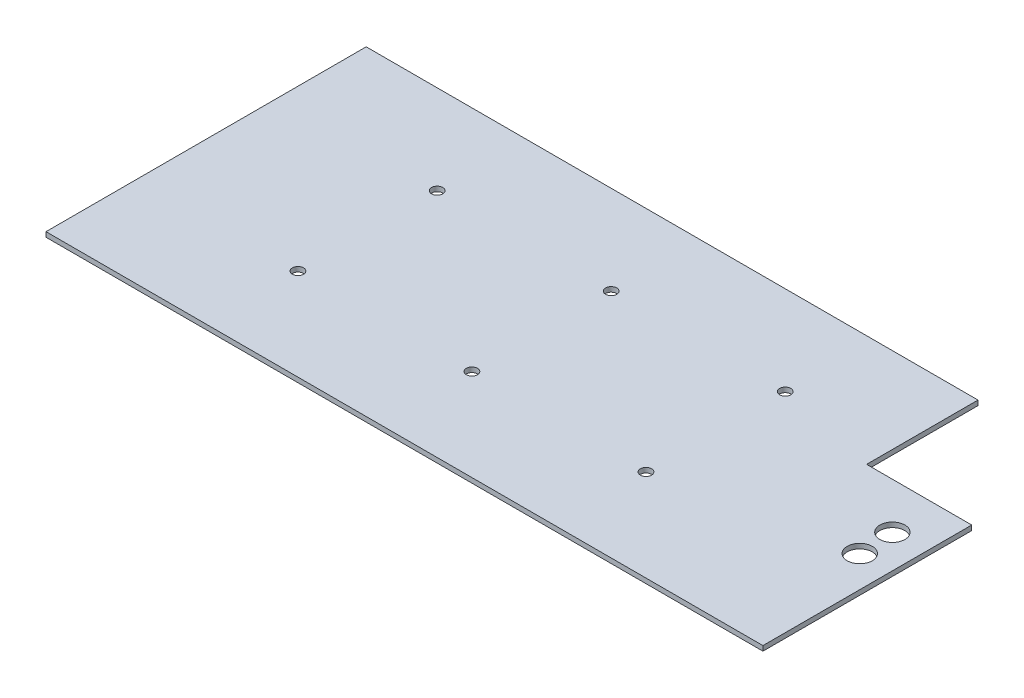
ISO-10303-21;
HEADER;
FILE_DESCRIPTION(('STEP AP214'),'2;1');
FILE_NAME('part.step','',(''),(''),'','','');
FILE_SCHEMA(('AUTOMOTIVE_DESIGN { 1 0 10303 214 1 1 1 1 }'));
ENDSEC;
DATA;
#1=APPLICATION_CONTEXT('core data for automotive mechanical design processes');
#2=APPLICATION_PROTOCOL_DEFINITION('international standard','automotive_design',2000,#1);
#3=PRODUCT_CONTEXT('',#1,'mechanical');
#4=PRODUCT('Part','Part','',(#3));
#5=PRODUCT_RELATED_PRODUCT_CATEGORY('part','',(#4));
#6=PRODUCT_DEFINITION_FORMATION('','',#4);
#7=PRODUCT_DEFINITION_CONTEXT('part definition',#1,'design');
#8=PRODUCT_DEFINITION('design','',#6,#7);
#9=PRODUCT_DEFINITION_SHAPE('','',#8);
#10=(LENGTH_UNIT() NAMED_UNIT(*) SI_UNIT(.MILLI.,.METRE.));
#11=(NAMED_UNIT(*) PLANE_ANGLE_UNIT() SI_UNIT($,.RADIAN.));
#12=(NAMED_UNIT(*) SI_UNIT($,.STERADIAN.) SOLID_ANGLE_UNIT());
#13=UNCERTAINTY_MEASURE_WITH_UNIT(LENGTH_MEASURE(1.E-05),#10,'distance_accuracy_value','');
#14=(GEOMETRIC_REPRESENTATION_CONTEXT(3) GLOBAL_UNCERTAINTY_ASSIGNED_CONTEXT((#13)) GLOBAL_UNIT_ASSIGNED_CONTEXT((#10,
#11,#12)) REPRESENTATION_CONTEXT('',''));
#15=CARTESIAN_POINT('',(0.,0.,0.));
#16=DIRECTION('',(0.,0.,1.));
#17=DIRECTION('',(1.,0.,0.));
#18=AXIS2_PLACEMENT_3D('',#15,#16,#17);
#19=CARTESIAN_POINT('',(515.,3.5,0.));
#20=DIRECTION('',(0.,0.,-1.));
#21=DIRECTION('',(-1.,0.,0.));
#22=AXIS2_PLACEMENT_3D('',#19,#20,#21);
#23=PLANE('',#22);
#24=DIRECTION('',(1.,0.,0.));
#25=VECTOR('',#24,1.);
#26=CARTESIAN_POINT('',(515.,0.,0.));
#27=LINE('',#26,#25);
#28=CARTESIAN_POINT('',(0.,0.,0.));
#29=VERTEX_POINT('',#28);
#30=CARTESIAN_POINT('',(515.,0.,0.));
#31=VERTEX_POINT('',#30);
#32=EDGE_CURVE('E135',#29,#31,#27,.T.);
#33=ORIENTED_EDGE('',*,*,#32,.T.);
#34=DIRECTION('',(0.,-1.,0.));
#35=VECTOR('',#34,1.);
#36=CARTESIAN_POINT('',(515.,3.5,0.));
#37=LINE('',#36,#35);
#38=CARTESIAN_POINT('',(515.,3.5,0.));
#39=VERTEX_POINT('',#38);
#40=EDGE_CURVE('E11',#39,#31,#37,.T.);
#41=ORIENTED_EDGE('',*,*,#40,.F.);
#42=DIRECTION('',(1.,0.,0.));
#43=VECTOR('',#42,1.);
#44=CARTESIAN_POINT('',(515.,3.5,0.));
#45=LINE('',#44,#43);
#46=CARTESIAN_POINT('',(0.,3.5,0.));
#47=VERTEX_POINT('',#46);
#48=EDGE_CURVE('E153',#47,#39,#45,.T.);
#49=ORIENTED_EDGE('',*,*,#48,.F.);
#50=DIRECTION('',(0.,-1.,0.));
#51=VECTOR('',#50,1.);
#52=CARTESIAN_POINT('',(0.,3.5,0.));
#53=LINE('',#52,#51);
#54=EDGE_CURVE('E131',#47,#29,#53,.T.);
#55=ORIENTED_EDGE('',*,*,#54,.T.);
#56=EDGE_LOOP('',(#33,#41,#49,#55));
#57=FACE_BOUND('',#56,.T.);
#58=ADVANCED_FACE('F45',(#57),#23,.F.);
#59=CARTESIAN_POINT('',(515.,3.5,-150.));
#60=DIRECTION('',(-1.,0.,0.));
#61=DIRECTION('',(0.,0.,1.));
#62=AXIS2_PLACEMENT_3D('',#59,#60,#61);
#63=PLANE('',#62);
#64=DIRECTION('',(0.,0.,-1.));
#65=VECTOR('',#64,1.);
#66=CARTESIAN_POINT('',(515.,0.,-150.));
#67=LINE('',#66,#65);
#68=CARTESIAN_POINT('',(515.,0.,-150.));
#69=VERTEX_POINT('',#68);
#70=EDGE_CURVE('E139',#31,#69,#67,.T.);
#71=ORIENTED_EDGE('',*,*,#70,.T.);
#72=DIRECTION('',(0.,-1.,0.));
#73=VECTOR('',#72,1.);
#74=CARTESIAN_POINT('',(515.,3.5,-150.));
#75=LINE('',#74,#73);
#76=CARTESIAN_POINT('',(515.,3.5,-150.));
#77=VERTEX_POINT('',#76);
#78=EDGE_CURVE('E54',#77,#69,#75,.T.);
#79=ORIENTED_EDGE('',*,*,#78,.F.);
#80=DIRECTION('',(0.,0.,-1.));
#81=VECTOR('',#80,1.);
#82=CARTESIAN_POINT('',(515.,3.5,-150.));
#83=LINE('',#82,#81);
#84=EDGE_CURVE('E96',#39,#77,#83,.T.);
#85=ORIENTED_EDGE('',*,*,#84,.F.);
#86=ORIENTED_EDGE('',*,*,#40,.T.);
#87=EDGE_LOOP('',(#71,#79,#85,#86));
#88=FACE_BOUND('',#87,.T.);
#89=ADVANCED_FACE('F275',(#88),#63,.F.);
#90=CARTESIAN_POINT('',(439.5,3.5,-150.));
#91=DIRECTION('',(0.,0.,1.));
#92=DIRECTION('',(1.,0.,0.));
#93=AXIS2_PLACEMENT_3D('',#90,#91,#92);
#94=PLANE('',#93);
#95=DIRECTION('',(-1.,0.,0.));
#96=VECTOR('',#95,1.);
#97=CARTESIAN_POINT('',(439.5,0.,-150.));
#98=LINE('',#97,#96);
#99=CARTESIAN_POINT('',(439.5,0.,-150.));
#100=VERTEX_POINT('',#99);
#101=EDGE_CURVE('E143',#69,#100,#98,.T.);
#102=ORIENTED_EDGE('',*,*,#101,.T.);
#103=DIRECTION('',(0.,-1.,0.));
#104=VECTOR('',#103,1.);
#105=CARTESIAN_POINT('',(439.5,3.5,-150.));
#106=LINE('',#105,#104);
#107=CARTESIAN_POINT('',(439.5,3.5,-150.));
#108=VERTEX_POINT('',#107);
#109=EDGE_CURVE('E124',#108,#100,#106,.T.);
#110=ORIENTED_EDGE('',*,*,#109,.F.);
#111=DIRECTION('',(-1.,0.,0.));
#112=VECTOR('',#111,1.);
#113=CARTESIAN_POINT('',(439.5,3.5,-150.));
#114=LINE('',#113,#112);
#115=EDGE_CURVE('E110',#77,#108,#114,.T.);
#116=ORIENTED_EDGE('',*,*,#115,.F.);
#117=ORIENTED_EDGE('',*,*,#78,.T.);
#118=EDGE_LOOP('',(#102,#110,#116,#117));
#119=FACE_BOUND('',#118,.T.);
#120=ADVANCED_FACE('F163',(#119),#94,.F.);
#121=CARTESIAN_POINT('',(439.5,3.5,-230.));
#122=DIRECTION('',(-1.,0.,0.));
#123=DIRECTION('',(0.,0.,1.));
#124=AXIS2_PLACEMENT_3D('',#121,#122,#123);
#125=PLANE('',#124);
#126=DIRECTION('',(0.,0.,-1.));
#127=VECTOR('',#126,1.);
#128=CARTESIAN_POINT('',(439.5,0.,-230.));
#129=LINE('',#128,#127);
#130=CARTESIAN_POINT('',(439.5,0.,-230.));
#131=VERTEX_POINT('',#130);
#132=EDGE_CURVE('E121',#100,#131,#129,.T.);
#133=ORIENTED_EDGE('',*,*,#132,.T.);
#134=DIRECTION('',(0.,-1.,0.));
#135=VECTOR('',#134,1.);
#136=CARTESIAN_POINT('',(439.5,3.5,-230.));
#137=LINE('',#136,#135);
#138=CARTESIAN_POINT('',(439.5,3.5,-230.));
#139=VERTEX_POINT('',#138);
#140=EDGE_CURVE('E118',#139,#131,#137,.T.);
#141=ORIENTED_EDGE('',*,*,#140,.F.);
#142=DIRECTION('',(0.,0.,-1.));
#143=VECTOR('',#142,1.);
#144=CARTESIAN_POINT('',(439.5,3.5,-230.));
#145=LINE('',#144,#143);
#146=EDGE_CURVE('E103',#108,#139,#145,.T.);
#147=ORIENTED_EDGE('',*,*,#146,.F.);
#148=ORIENTED_EDGE('',*,*,#109,.T.);
#149=EDGE_LOOP('',(#133,#141,#147,#148));
#150=FACE_BOUND('',#149,.T.);
#151=ADVANCED_FACE('F119',(#150),#125,.F.);
#152=CARTESIAN_POINT('',(0.,3.5,-230.));
#153=DIRECTION('',(0.,0.,1.));
#154=DIRECTION('',(1.,0.,0.));
#155=AXIS2_PLACEMENT_3D('',#152,#153,#154);
#156=PLANE('',#155);
#157=DIRECTION('',(-1.,0.,0.));
#158=VECTOR('',#157,1.);
#159=CARTESIAN_POINT('',(0.,0.,-230.));
#160=LINE('',#159,#158);
#161=CARTESIAN_POINT('',(0.,0.,-230.));
#162=VERTEX_POINT('',#161);
#163=EDGE_CURVE('E148',#131,#162,#160,.T.);
#164=ORIENTED_EDGE('',*,*,#163,.T.);
#165=DIRECTION('',(0.,-1.,0.));
#166=VECTOR('',#165,1.);
#167=CARTESIAN_POINT('',(0.,3.5,-230.));
#168=LINE('',#167,#166);
#169=CARTESIAN_POINT('',(0.,3.5,-230.));
#170=VERTEX_POINT('',#169);
#171=EDGE_CURVE('E125',#170,#162,#168,.T.);
#172=ORIENTED_EDGE('',*,*,#171,.F.);
#173=DIRECTION('',(-1.,0.,0.));
#174=VECTOR('',#173,1.);
#175=CARTESIAN_POINT('',(20.,3.5,-230.));
#176=LINE('',#175,#174);
#177=EDGE_CURVE('E107',#139,#170,#176,.T.);
#178=ORIENTED_EDGE('',*,*,#177,.F.);
#179=ORIENTED_EDGE('',*,*,#140,.T.);
#180=EDGE_LOOP('',(#164,#172,#178,#179));
#181=FACE_BOUND('',#180,.T.);
#182=ADVANCED_FACE('F127',(#181),#156,.F.);
#183=CARTESIAN_POINT('',(0.,3.5,0.));
#184=DIRECTION('',(1.,0.,0.));
#185=DIRECTION('',(0.,0.,-1.));
#186=AXIS2_PLACEMENT_3D('',#183,#184,#185);
#187=PLANE('',#186);
#188=DIRECTION('',(0.,0.,1.));
#189=VECTOR('',#188,1.);
#190=CARTESIAN_POINT('',(0.,0.,0.));
#191=LINE('',#190,#189);
#192=EDGE_CURVE('E84',#162,#29,#191,.T.);
#193=ORIENTED_EDGE('',*,*,#192,.T.);
#194=ORIENTED_EDGE('',*,*,#54,.F.);
#195=DIRECTION('',(0.,0.,1.));
#196=VECTOR('',#195,1.);
#197=CARTESIAN_POINT('',(0.,3.5,-150.));
#198=LINE('',#197,#196);
#199=EDGE_CURVE('E62',#170,#47,#198,.T.);
#200=ORIENTED_EDGE('',*,*,#199,.F.);
#201=ORIENTED_EDGE('',*,*,#171,.T.);
#202=EDGE_LOOP('',(#193,#194,#200,#201));
#203=FACE_BOUND('',#202,.T.);
#204=ADVANCED_FACE('F165',(#203),#187,.F.);
#205=CARTESIAN_POINT('',(0.,3.5,0.));
#206=DIRECTION('',(0.,-1.,0.));
#207=DIRECTION('',(0.,0.,-1.));
#208=AXIS2_PLACEMENT_3D('',#205,#206,#207);
#209=PLANE('',#208);
#210=CARTESIAN_POINT('',(240.,3.5,-166.));
#211=DIRECTION('',(0.,-1.,0.));
#212=DIRECTION('',(0.,0.,-1.));
#213=AXIS2_PLACEMENT_3D('',#210,#211,#212);
#214=CIRCLE('',#213,3.99999999999999);
#215=CARTESIAN_POINT('',(240.,3.5,-170.));
#216=VERTEX_POINT('',#215);
#217=EDGE_CURVE('E140',#216,#216,#214,.T.);
#218=ORIENTED_EDGE('',*,*,#217,.T.);
#219=EDGE_LOOP('',(#218));
#220=FACE_BOUND('',#219,.T.);
#221=CARTESIAN_POINT('',(365.,3.5,-166.));
#222=DIRECTION('',(0.,-1.,0.));
#223=DIRECTION('',(0.,0.,-1.));
#224=AXIS2_PLACEMENT_3D('',#221,#222,#223);
#225=CIRCLE('',#224,3.99999999999999);
#226=CARTESIAN_POINT('',(365.,3.5,-170.));
#227=VERTEX_POINT('',#226);
#228=EDGE_CURVE('E178',#227,#227,#225,.T.);
#229=ORIENTED_EDGE('',*,*,#228,.T.);
#230=EDGE_LOOP('',(#229));
#231=FACE_BOUND('',#230,.T.);
#232=CARTESIAN_POINT('',(365.,3.5,-66.));
#233=DIRECTION('',(0.,-1.,0.));
#234=DIRECTION('',(0.,0.,-1.));
#235=AXIS2_PLACEMENT_3D('',#232,#233,#234);
#236=CIRCLE('',#235,3.99999999999999);
#237=CARTESIAN_POINT('',(365.,3.5,-70.));
#238=VERTEX_POINT('',#237);
#239=EDGE_CURVE('E182',#238,#238,#236,.T.);
#240=ORIENTED_EDGE('',*,*,#239,.T.);
#241=EDGE_LOOP('',(#240));
#242=FACE_BOUND('',#241,.T.);
#243=CARTESIAN_POINT('',(240.,3.5,-66.));
#244=DIRECTION('',(0.,-1.,0.));
#245=DIRECTION('',(0.,0.,-1.));
#246=AXIS2_PLACEMENT_3D('',#243,#244,#245);
#247=CIRCLE('',#246,3.99999999999999);
#248=CARTESIAN_POINT('',(240.,3.5,-70.));
#249=VERTEX_POINT('',#248);
#250=EDGE_CURVE('E186',#249,#249,#247,.T.);
#251=ORIENTED_EDGE('',*,*,#250,.T.);
#252=EDGE_LOOP('',(#251));
#253=FACE_BOUND('',#252,.T.);
#254=CARTESIAN_POINT('',(115.,3.5,-66.));
#255=DIRECTION('',(0.,-1.,0.));
#256=DIRECTION('',(0.,0.,-1.));
#257=AXIS2_PLACEMENT_3D('',#254,#255,#256);
#258=CIRCLE('',#257,3.99999999999999);
#259=CARTESIAN_POINT('',(115.,3.5,-70.));
#260=VERTEX_POINT('',#259);
#261=EDGE_CURVE('E190',#260,#260,#258,.T.);
#262=ORIENTED_EDGE('',*,*,#261,.T.);
#263=EDGE_LOOP('',(#262));
#264=FACE_BOUND('',#263,.T.);
#265=CARTESIAN_POINT('',(492.51750302626,3.5,-92.0460988107012));
#266=DIRECTION('',(0.,-1.,0.));
#267=DIRECTION('',(0.,0.,-1.));
#268=AXIS2_PLACEMENT_3D('',#265,#266,#267);
#269=CIRCLE('',#268,9.00000000000009);
#270=CARTESIAN_POINT('',(492.51750302626,3.5,-101.046098810701));
#271=VERTEX_POINT('',#270);
#272=EDGE_CURVE('E194',#271,#271,#269,.T.);
#273=ORIENTED_EDGE('',*,*,#272,.T.);
#274=EDGE_LOOP('',(#273));
#275=FACE_BOUND('',#274,.T.);
#276=CARTESIAN_POINT('',(491.,3.5,-117.));
#277=DIRECTION('',(0.,-1.,0.));
#278=DIRECTION('',(0.,0.,-1.));
#279=AXIS2_PLACEMENT_3D('',#276,#277,#278);
#280=CIRCLE('',#279,8.99999999999999);
#281=CARTESIAN_POINT('',(491.,3.5,-126.));
#282=VERTEX_POINT('',#281);
#283=EDGE_CURVE('E198',#282,#282,#280,.T.);
#284=ORIENTED_EDGE('',*,*,#283,.T.);
#285=EDGE_LOOP('',(#284));
#286=FACE_BOUND('',#285,.T.);
#287=CARTESIAN_POINT('',(115.,3.5,-166.));
#288=DIRECTION('',(0.,-1.,0.));
#289=DIRECTION('',(0.,0.,-1.));
#290=AXIS2_PLACEMENT_3D('',#287,#288,#289);
#291=CIRCLE('',#290,3.99999999999999);
#292=CARTESIAN_POINT('',(115.,3.5,-170.));
#293=VERTEX_POINT('',#292);
#294=EDGE_CURVE('E202',#293,#293,#291,.T.);
#295=ORIENTED_EDGE('',*,*,#294,.T.);
#296=EDGE_LOOP('',(#295));
#297=FACE_BOUND('',#296,.T.);
#298=ORIENTED_EDGE('',*,*,#48,.T.);
#299=ORIENTED_EDGE('',*,*,#84,.T.);
#300=ORIENTED_EDGE('',*,*,#115,.T.);
#301=ORIENTED_EDGE('',*,*,#146,.T.);
#302=ORIENTED_EDGE('',*,*,#177,.T.);
#303=ORIENTED_EDGE('',*,*,#199,.T.);
#304=EDGE_LOOP('',(#298,#299,#300,#301,#302,#303));
#305=FACE_BOUND('',#304,.T.);
#306=ADVANCED_FACE('F105',(#220,#231,#242,#253,#264,#275,#286,#297,#305),#209,.F.);
#307=CARTESIAN_POINT('',(0.,0.,0.));
#308=DIRECTION('',(0.,-1.,0.));
#309=DIRECTION('',(0.,0.,-1.));
#310=AXIS2_PLACEMENT_3D('',#307,#308,#309);
#311=PLANE('',#310);
#312=CARTESIAN_POINT('',(240.,0.,-166.));
#313=DIRECTION('',(0.,1.,0.));
#314=DIRECTION('',(0.,0.,1.));
#315=AXIS2_PLACEMENT_3D('',#312,#313,#314);
#316=CIRCLE('',#315,3.99999999999999);
#317=CARTESIAN_POINT('',(240.,0.,-162.));
#318=VERTEX_POINT('',#317);
#319=EDGE_CURVE('E210',#318,#318,#316,.T.);
#320=ORIENTED_EDGE('',*,*,#319,.T.);
#321=EDGE_LOOP('',(#320));
#322=FACE_BOUND('',#321,.T.);
#323=CARTESIAN_POINT('',(365.,0.,-166.));
#324=DIRECTION('',(0.,1.,0.));
#325=DIRECTION('',(0.,0.,1.));
#326=AXIS2_PLACEMENT_3D('',#323,#324,#325);
#327=CIRCLE('',#326,3.99999999999999);
#328=CARTESIAN_POINT('',(365.,0.,-162.));
#329=VERTEX_POINT('',#328);
#330=EDGE_CURVE('E220',#329,#329,#327,.T.);
#331=ORIENTED_EDGE('',*,*,#330,.T.);
#332=EDGE_LOOP('',(#331));
#333=FACE_BOUND('',#332,.T.);
#334=CARTESIAN_POINT('',(365.,0.,-66.));
#335=DIRECTION('',(0.,1.,0.));
#336=DIRECTION('',(0.,0.,1.));
#337=AXIS2_PLACEMENT_3D('',#334,#335,#336);
#338=CIRCLE('',#337,3.99999999999999);
#339=CARTESIAN_POINT('',(365.,0.,-62.));
#340=VERTEX_POINT('',#339);
#341=EDGE_CURVE('E215',#340,#340,#338,.T.);
#342=ORIENTED_EDGE('',*,*,#341,.T.);
#343=EDGE_LOOP('',(#342));
#344=FACE_BOUND('',#343,.T.);
#345=CARTESIAN_POINT('',(240.,0.,-66.));
#346=DIRECTION('',(0.,1.,0.));
#347=DIRECTION('',(0.,0.,1.));
#348=AXIS2_PLACEMENT_3D('',#345,#346,#347);
#349=CIRCLE('',#348,3.99999999999999);
#350=CARTESIAN_POINT('',(240.,0.,-62.));
#351=VERTEX_POINT('',#350);
#352=EDGE_CURVE('E211',#351,#351,#349,.T.);
#353=ORIENTED_EDGE('',*,*,#352,.T.);
#354=EDGE_LOOP('',(#353));
#355=FACE_BOUND('',#354,.T.);
#356=CARTESIAN_POINT('',(115.,0.,-66.));
#357=DIRECTION('',(0.,1.,0.));
#358=DIRECTION('',(0.,0.,1.));
#359=AXIS2_PLACEMENT_3D('',#356,#357,#358);
#360=CIRCLE('',#359,3.99999999999999);
#361=CARTESIAN_POINT('',(115.,0.,-62.));
#362=VERTEX_POINT('',#361);
#363=EDGE_CURVE('E216',#362,#362,#360,.T.);
#364=ORIENTED_EDGE('',*,*,#363,.T.);
#365=EDGE_LOOP('',(#364));
#366=FACE_BOUND('',#365,.T.);
#367=CARTESIAN_POINT('',(492.51750302626,0.,-92.0460988107012));
#368=DIRECTION('',(0.,1.,0.));
#369=DIRECTION('',(0.,0.,1.));
#370=AXIS2_PLACEMENT_3D('',#367,#368,#369);
#371=CIRCLE('',#370,9.00000000000009);
#372=CARTESIAN_POINT('',(492.51750302626,0.,-83.0460988107011));
#373=VERTEX_POINT('',#372);
#374=EDGE_CURVE('E231',#373,#373,#371,.T.);
#375=ORIENTED_EDGE('',*,*,#374,.T.);
#376=EDGE_LOOP('',(#375));
#377=FACE_BOUND('',#376,.T.);
#378=CARTESIAN_POINT('',(491.,0.,-117.));
#379=DIRECTION('',(0.,1.,0.));
#380=DIRECTION('',(0.,0.,1.));
#381=AXIS2_PLACEMENT_3D('',#378,#379,#380);
#382=CIRCLE('',#381,8.99999999999999);
#383=CARTESIAN_POINT('',(491.,0.,-108.));
#384=VERTEX_POINT('',#383);
#385=EDGE_CURVE('E227',#384,#384,#382,.T.);
#386=ORIENTED_EDGE('',*,*,#385,.T.);
#387=EDGE_LOOP('',(#386));
#388=FACE_BOUND('',#387,.T.);
#389=CARTESIAN_POINT('',(115.,0.,-166.));
#390=DIRECTION('',(0.,1.,0.));
#391=DIRECTION('',(0.,0.,1.));
#392=AXIS2_PLACEMENT_3D('',#389,#390,#391);
#393=CIRCLE('',#392,3.99999999999999);
#394=CARTESIAN_POINT('',(115.,0.,-162.));
#395=VERTEX_POINT('',#394);
#396=EDGE_CURVE('E206',#395,#395,#393,.T.);
#397=ORIENTED_EDGE('',*,*,#396,.T.);
#398=EDGE_LOOP('',(#397));
#399=FACE_BOUND('',#398,.T.);
#400=ORIENTED_EDGE('',*,*,#32,.F.);
#401=ORIENTED_EDGE('',*,*,#192,.F.);
#402=ORIENTED_EDGE('',*,*,#163,.F.);
#403=ORIENTED_EDGE('',*,*,#132,.F.);
#404=ORIENTED_EDGE('',*,*,#101,.F.);
#405=ORIENTED_EDGE('',*,*,#70,.F.);
#406=EDGE_LOOP('',(#400,#401,#402,#403,#404,#405));
#407=FACE_BOUND('',#406,.T.);
#408=ADVANCED_FACE('F164',(#322,#333,#344,#355,#366,#377,#388,#399,#407),#311,.T.);
#409=CARTESIAN_POINT('',(115.,0.,-166.));
#410=DIRECTION('',(0.,1.,0.));
#411=DIRECTION('',(0.,0.,1.));
#412=AXIS2_PLACEMENT_3D('',#409,#410,#411);
#413=CYLINDRICAL_SURFACE('',#412,3.99999999999999);
#414=ORIENTED_EDGE('',*,*,#396,.F.);
#415=EDGE_LOOP('',(#414));
#416=FACE_BOUND('',#415,.T.);
#417=ORIENTED_EDGE('',*,*,#294,.F.);
#418=EDGE_LOOP('',(#417));
#419=FACE_BOUND('',#418,.T.);
#420=ADVANCED_FACE('F259',(#416,#419),#413,.F.);
#421=CARTESIAN_POINT('',(491.,0.,-117.));
#422=DIRECTION('',(0.,1.,0.));
#423=DIRECTION('',(0.,0.,1.));
#424=AXIS2_PLACEMENT_3D('',#421,#422,#423);
#425=CYLINDRICAL_SURFACE('',#424,8.99999999999999);
#426=ORIENTED_EDGE('',*,*,#385,.F.);
#427=EDGE_LOOP('',(#426));
#428=FACE_BOUND('',#427,.T.);
#429=ORIENTED_EDGE('',*,*,#283,.F.);
#430=EDGE_LOOP('',(#429));
#431=FACE_BOUND('',#430,.T.);
#432=ADVANCED_FACE('F261',(#428,#431),#425,.F.);
#433=CARTESIAN_POINT('',(492.51750302626,0.,-92.0460988107012));
#434=DIRECTION('',(0.,1.,0.));
#435=DIRECTION('',(0.,0.,1.));
#436=AXIS2_PLACEMENT_3D('',#433,#434,#435);
#437=CYLINDRICAL_SURFACE('',#436,9.00000000000009);
#438=ORIENTED_EDGE('',*,*,#374,.F.);
#439=EDGE_LOOP('',(#438));
#440=FACE_BOUND('',#439,.T.);
#441=ORIENTED_EDGE('',*,*,#272,.F.);
#442=EDGE_LOOP('',(#441));
#443=FACE_BOUND('',#442,.T.);
#444=ADVANCED_FACE('F245',(#440,#443),#437,.F.);
#445=CARTESIAN_POINT('',(115.,0.,-66.));
#446=DIRECTION('',(0.,1.,0.));
#447=DIRECTION('',(0.,0.,1.));
#448=AXIS2_PLACEMENT_3D('',#445,#446,#447);
#449=CYLINDRICAL_SURFACE('',#448,3.99999999999999);
#450=ORIENTED_EDGE('',*,*,#363,.F.);
#451=EDGE_LOOP('',(#450));
#452=FACE_BOUND('',#451,.T.);
#453=ORIENTED_EDGE('',*,*,#261,.F.);
#454=EDGE_LOOP('',(#453));
#455=FACE_BOUND('',#454,.T.);
#456=ADVANCED_FACE('F241',(#452,#455),#449,.F.);
#457=CARTESIAN_POINT('',(240.,0.,-66.));
#458=DIRECTION('',(0.,1.,0.));
#459=DIRECTION('',(0.,0.,1.));
#460=AXIS2_PLACEMENT_3D('',#457,#458,#459);
#461=CYLINDRICAL_SURFACE('',#460,3.99999999999999);
#462=ORIENTED_EDGE('',*,*,#352,.F.);
#463=EDGE_LOOP('',(#462));
#464=FACE_BOUND('',#463,.T.);
#465=ORIENTED_EDGE('',*,*,#250,.F.);
#466=EDGE_LOOP('',(#465));
#467=FACE_BOUND('',#466,.T.);
#468=ADVANCED_FACE('F244',(#464,#467),#461,.F.);
#469=CARTESIAN_POINT('',(365.,0.,-66.));
#470=DIRECTION('',(0.,1.,0.));
#471=DIRECTION('',(0.,0.,1.));
#472=AXIS2_PLACEMENT_3D('',#469,#470,#471);
#473=CYLINDRICAL_SURFACE('',#472,3.99999999999999);
#474=ORIENTED_EDGE('',*,*,#341,.F.);
#475=EDGE_LOOP('',(#474));
#476=FACE_BOUND('',#475,.T.);
#477=ORIENTED_EDGE('',*,*,#239,.F.);
#478=EDGE_LOOP('',(#477));
#479=FACE_BOUND('',#478,.T.);
#480=ADVANCED_FACE('F335',(#476,#479),#473,.F.);
#481=CARTESIAN_POINT('',(365.,0.,-166.));
#482=DIRECTION('',(0.,1.,0.));
#483=DIRECTION('',(0.,0.,1.));
#484=AXIS2_PLACEMENT_3D('',#481,#482,#483);
#485=CYLINDRICAL_SURFACE('',#484,3.99999999999999);
#486=ORIENTED_EDGE('',*,*,#330,.F.);
#487=EDGE_LOOP('',(#486));
#488=FACE_BOUND('',#487,.T.);
#489=ORIENTED_EDGE('',*,*,#228,.F.);
#490=EDGE_LOOP('',(#489));
#491=FACE_BOUND('',#490,.T.);
#492=ADVANCED_FACE('F344',(#488,#491),#485,.F.);
#493=CARTESIAN_POINT('',(240.,0.,-166.));
#494=DIRECTION('',(0.,1.,0.));
#495=DIRECTION('',(0.,0.,1.));
#496=AXIS2_PLACEMENT_3D('',#493,#494,#495);
#497=CYLINDRICAL_SURFACE('',#496,3.99999999999999);
#498=ORIENTED_EDGE('',*,*,#319,.F.);
#499=EDGE_LOOP('',(#498));
#500=FACE_BOUND('',#499,.T.);
#501=ORIENTED_EDGE('',*,*,#217,.F.);
#502=EDGE_LOOP('',(#501));
#503=FACE_BOUND('',#502,.T.);
#504=ADVANCED_FACE('F354',(#500,#503),#497,.F.);
#505=CLOSED_SHELL('',(#58,#89,#120,#151,#182,#204,#306,#408,#420,#432,#444,#456,#468,#480,#492,#504));
#506=MANIFOLD_SOLID_BREP('B2',#505);
#507=ADVANCED_BREP_SHAPE_REPRESENTATION('',(#18,#506),#14);
#508=SHAPE_DEFINITION_REPRESENTATION(#9,#507);
ENDSEC;
END-ISO-10303-21;
